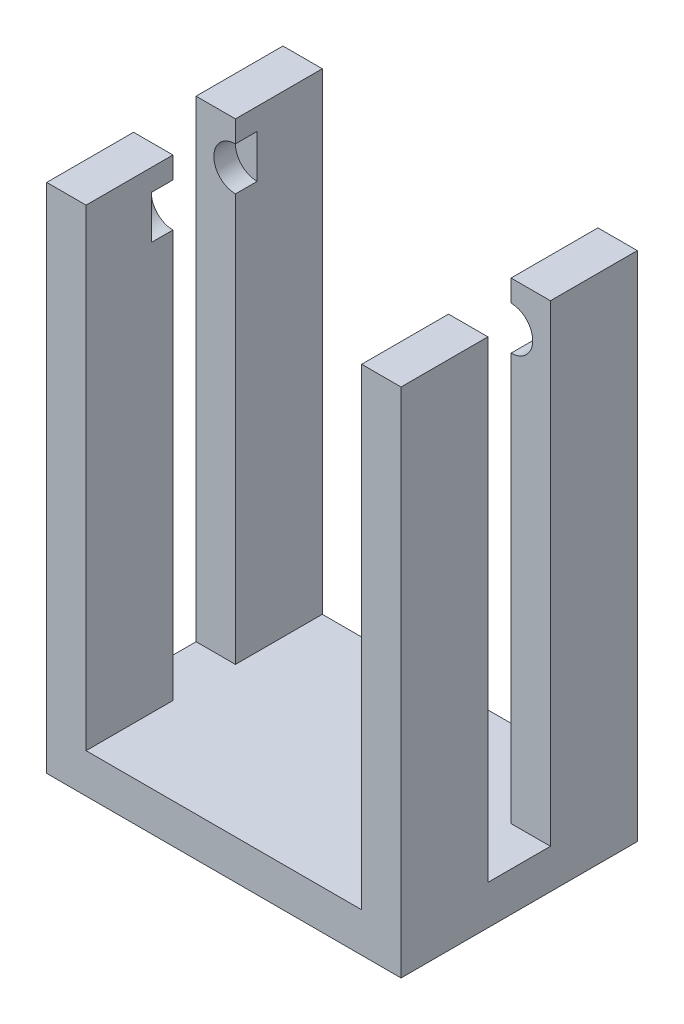
ISO-10303-21;
HEADER;
FILE_DESCRIPTION(('STEP AP214'),'2;1');
FILE_NAME('part.step','',(''),(''),'','','');
FILE_SCHEMA(('AUTOMOTIVE_DESIGN { 1 0 10303 214 1 1 1 1 }'));
ENDSEC;
DATA;
#1=APPLICATION_CONTEXT('core data for automotive mechanical design processes');
#2=APPLICATION_PROTOCOL_DEFINITION('international standard','automotive_design',2000,#1);
#3=PRODUCT_CONTEXT('',#1,'mechanical');
#4=PRODUCT('Part','Part','',(#3));
#5=PRODUCT_RELATED_PRODUCT_CATEGORY('part','',(#4));
#6=PRODUCT_DEFINITION_FORMATION('','',#4);
#7=PRODUCT_DEFINITION_CONTEXT('part definition',#1,'design');
#8=PRODUCT_DEFINITION('design','',#6,#7);
#9=PRODUCT_DEFINITION_SHAPE('','',#8);
#10=(LENGTH_UNIT() NAMED_UNIT(*) SI_UNIT(.MILLI.,.METRE.));
#11=(NAMED_UNIT(*) PLANE_ANGLE_UNIT() SI_UNIT($,.RADIAN.));
#12=(NAMED_UNIT(*) SI_UNIT($,.STERADIAN.) SOLID_ANGLE_UNIT());
#13=UNCERTAINTY_MEASURE_WITH_UNIT(LENGTH_MEASURE(1.E-05),#10,'distance_accuracy_value','');
#14=(GEOMETRIC_REPRESENTATION_CONTEXT(3) GLOBAL_UNCERTAINTY_ASSIGNED_CONTEXT((#13)) GLOBAL_UNIT_ASSIGNED_CONTEXT((#10,
#11,#12)) REPRESENTATION_CONTEXT('',''));
#15=CARTESIAN_POINT('',(0.,0.,0.));
#16=DIRECTION('',(0.,0.,1.));
#17=DIRECTION('',(1.,0.,0.));
#18=AXIS2_PLACEMENT_3D('',#15,#16,#17);
#19=CARTESIAN_POINT('',(0.,1.,0.));
#20=DIRECTION('',(0.,1.,0.));
#21=DIRECTION('',(0.,0.,1.));
#22=AXIS2_PLACEMENT_3D('',#19,#20,#21);
#23=PLANE('',#22);
#24=DIRECTION('',(0.,0.,-1.));
#25=VECTOR('',#24,1.);
#26=CARTESIAN_POINT('',(3.5,1.,0.));
#27=LINE('',#26,#25);
#28=CARTESIAN_POINT('',(3.5,1.,-0.793802437785672));
#29=VERTEX_POINT('',#28);
#30=CARTESIAN_POINT('',(3.5,1.,-3.));
#31=VERTEX_POINT('',#30);
#32=EDGE_CURVE('E280',#29,#31,#27,.T.);
#33=ORIENTED_EDGE('',*,*,#32,.T.);
#34=DIRECTION('',(-1.,0.,0.));
#35=VECTOR('',#34,1.);
#36=CARTESIAN_POINT('',(-4.5,1.,-3.));
#37=LINE('',#36,#35);
#38=CARTESIAN_POINT('',(-3.5,1.,-3.));
#39=VERTEX_POINT('',#38);
#40=EDGE_CURVE('E426',#31,#39,#37,.T.);
#41=ORIENTED_EDGE('',*,*,#40,.T.);
#42=DIRECTION('',(0.,0.,-1.));
#43=VECTOR('',#42,1.);
#44=CARTESIAN_POINT('',(-3.5,1.,0.));
#45=LINE('',#44,#43);
#46=CARTESIAN_POINT('',(-3.5,1.,-0.793802437785672));
#47=VERTEX_POINT('',#46);
#48=EDGE_CURVE('E395',#47,#39,#45,.T.);
#49=ORIENTED_EDGE('',*,*,#48,.F.);
#50=DIRECTION('',(1.,0.,0.));
#51=VECTOR('',#50,1.);
#52=CARTESIAN_POINT('',(0.,1.,-0.793802437785672));
#53=LINE('',#52,#51);
#54=CARTESIAN_POINT('',(-4.5,1.,-0.793802437785672));
#55=VERTEX_POINT('',#54);
#56=EDGE_CURVE('E389',#55,#47,#53,.T.);
#57=ORIENTED_EDGE('',*,*,#56,.F.);
#58=DIRECTION('',(0.,0.,1.));
#59=VECTOR('',#58,1.);
#60=CARTESIAN_POINT('',(-4.5,1.,-3.));
#61=LINE('',#60,#59);
#62=CARTESIAN_POINT('',(-4.5,1.,0.793802437785675));
#63=VERTEX_POINT('',#62);
#64=EDGE_CURVE('E430',#55,#63,#61,.T.);
#65=ORIENTED_EDGE('',*,*,#64,.T.);
#66=DIRECTION('',(1.,0.,0.));
#67=VECTOR('',#66,1.);
#68=CARTESIAN_POINT('',(0.,1.,0.793802437785675));
#69=LINE('',#68,#67);
#70=CARTESIAN_POINT('',(-3.5,1.,0.793802437785675));
#71=VERTEX_POINT('',#70);
#72=EDGE_CURVE('E359',#63,#71,#69,.T.);
#73=ORIENTED_EDGE('',*,*,#72,.T.);
#74=DIRECTION('',(0.,0.,1.));
#75=VECTOR('',#74,1.);
#76=CARTESIAN_POINT('',(-3.5,1.,0.));
#77=LINE('',#76,#75);
#78=CARTESIAN_POINT('',(-3.5,1.,3.));
#79=VERTEX_POINT('',#78);
#80=EDGE_CURVE('E353',#71,#79,#77,.T.);
#81=ORIENTED_EDGE('',*,*,#80,.T.);
#82=DIRECTION('',(1.,0.,0.));
#83=VECTOR('',#82,1.);
#84=CARTESIAN_POINT('',(-4.5,1.,3.));
#85=LINE('',#84,#83);
#86=CARTESIAN_POINT('',(3.5,1.,3.));
#87=VERTEX_POINT('',#86);
#88=EDGE_CURVE('E433',#79,#87,#85,.T.);
#89=ORIENTED_EDGE('',*,*,#88,.T.);
#90=DIRECTION('',(0.,0.,1.));
#91=VECTOR('',#90,1.);
#92=CARTESIAN_POINT('',(3.5,1.,0.));
#93=LINE('',#92,#91);
#94=CARTESIAN_POINT('',(3.5,1.,0.793802437785675));
#95=VERTEX_POINT('',#94);
#96=EDGE_CURVE('E324',#95,#87,#93,.T.);
#97=ORIENTED_EDGE('',*,*,#96,.F.);
#98=DIRECTION('',(-1.,0.,0.));
#99=VECTOR('',#98,1.);
#100=CARTESIAN_POINT('',(0.,1.,0.793802437785675));
#101=LINE('',#100,#99);
#102=CARTESIAN_POINT('',(4.5,1.,0.793802437785675));
#103=VERTEX_POINT('',#102);
#104=EDGE_CURVE('E318',#103,#95,#101,.T.);
#105=ORIENTED_EDGE('',*,*,#104,.F.);
#106=DIRECTION('',(0.,0.,-1.));
#107=VECTOR('',#106,1.);
#108=CARTESIAN_POINT('',(4.5,1.,-3.));
#109=LINE('',#108,#107);
#110=CARTESIAN_POINT('',(4.5,1.,-0.793802437785672));
#111=VERTEX_POINT('',#110);
#112=EDGE_CURVE('E423',#103,#111,#109,.T.);
#113=ORIENTED_EDGE('',*,*,#112,.T.);
#114=DIRECTION('',(-1.,0.,0.));
#115=VECTOR('',#114,1.);
#116=CARTESIAN_POINT('',(0.,1.,-0.793802437785671));
#117=LINE('',#116,#115);
#118=EDGE_CURVE('E288',#111,#29,#117,.T.);
#119=ORIENTED_EDGE('',*,*,#118,.T.);
#120=EDGE_LOOP('',(#33,#41,#49,#57,#65,#73,#81,#89,#97,#105,#113,#119));
#121=FACE_BOUND('',#120,.T.);
#122=ADVANCED_FACE('F47',(#121),#23,.T.);
#123=CARTESIAN_POINT('',(4.5,1.,-3.));
#124=DIRECTION('',(-1.,0.,0.));
#125=DIRECTION('',(0.,0.,1.));
#126=AXIS2_PLACEMENT_3D('',#123,#124,#125);
#127=PLANE('',#126);
#128=DIRECTION('',(0.,0.,-1.));
#129=VECTOR('',#128,1.);
#130=CARTESIAN_POINT('',(4.5,0.,-3.));
#131=LINE('',#130,#129);
#132=CARTESIAN_POINT('',(4.5,0.,3.));
#133=VERTEX_POINT('',#132);
#134=CARTESIAN_POINT('',(4.5,0.,-3.));
#135=VERTEX_POINT('',#134);
#136=EDGE_CURVE('E422',#133,#135,#131,.T.);
#137=ORIENTED_EDGE('',*,*,#136,.T.);
#138=DIRECTION('',(0.,-1.,0.));
#139=VECTOR('',#138,1.);
#140=CARTESIAN_POINT('',(4.5,1.,-3.));
#141=LINE('',#140,#139);
#142=CARTESIAN_POINT('',(4.5,13.,-3.));
#143=VERTEX_POINT('',#142);
#144=EDGE_CURVE('E11',#143,#135,#141,.T.);
#145=ORIENTED_EDGE('',*,*,#144,.F.);
#146=DIRECTION('',(0.,0.,-1.));
#147=VECTOR('',#146,1.);
#148=CARTESIAN_POINT('',(4.5,13.,0.));
#149=LINE('',#148,#147);
#150=CARTESIAN_POINT('',(4.5,13.,-0.793802437785672));
#151=VERTEX_POINT('',#150);
#152=EDGE_CURVE('E292',#151,#143,#149,.T.);
#153=ORIENTED_EDGE('',*,*,#152,.F.);
#154=DIRECTION('',(0.,-1.,0.));
#155=VECTOR('',#154,1.);
#156=CARTESIAN_POINT('',(4.5,13.,-0.793802437785672));
#157=LINE('',#156,#155);
#158=EDGE_CURVE('E309',#151,#111,#157,.T.);
#159=ORIENTED_EDGE('',*,*,#158,.T.);
#160=ORIENTED_EDGE('',*,*,#112,.F.);
#161=DIRECTION('',(0.,-1.,0.));
#162=VECTOR('',#161,1.);
#163=CARTESIAN_POINT('',(4.5,13.,0.793802437785675));
#164=LINE('',#163,#162);
#165=CARTESIAN_POINT('',(4.5,13.,0.793802437785675));
#166=VERTEX_POINT('',#165);
#167=EDGE_CURVE('E334',#166,#103,#164,.T.);
#168=ORIENTED_EDGE('',*,*,#167,.F.);
#169=DIRECTION('',(0.,0.,-1.));
#170=VECTOR('',#169,1.);
#171=CARTESIAN_POINT('',(4.5,13.,0.));
#172=LINE('',#171,#170);
#173=CARTESIAN_POINT('',(4.5,13.,3.));
#174=VERTEX_POINT('',#173);
#175=EDGE_CURVE('E331',#174,#166,#172,.T.);
#176=ORIENTED_EDGE('',*,*,#175,.F.);
#177=DIRECTION('',(0.,-1.,0.));
#178=VECTOR('',#177,1.);
#179=CARTESIAN_POINT('',(4.5,1.,3.));
#180=LINE('',#179,#178);
#181=EDGE_CURVE('E436',#174,#133,#180,.T.);
#182=ORIENTED_EDGE('',*,*,#181,.T.);
#183=EDGE_LOOP('',(#137,#145,#153,#159,#160,#168,#176,#182));
#184=FACE_BOUND('',#183,.T.);
#185=ADVANCED_FACE('F49',(#184),#127,.F.);
#186=CARTESIAN_POINT('',(-4.5,1.,-3.));
#187=DIRECTION('',(0.,0.,1.));
#188=DIRECTION('',(1.,0.,0.));
#189=AXIS2_PLACEMENT_3D('',#186,#187,#188);
#190=PLANE('',#189);
#191=DIRECTION('',(-1.,0.,0.));
#192=VECTOR('',#191,1.);
#193=CARTESIAN_POINT('',(-4.5,0.,-3.));
#194=LINE('',#193,#192);
#195=CARTESIAN_POINT('',(-4.5,0.,-3.));
#196=VERTEX_POINT('',#195);
#197=EDGE_CURVE('E440',#135,#196,#194,.T.);
#198=ORIENTED_EDGE('',*,*,#197,.T.);
#199=DIRECTION('',(0.,-1.,0.));
#200=VECTOR('',#199,1.);
#201=CARTESIAN_POINT('',(-4.5,1.,-3.));
#202=LINE('',#201,#200);
#203=CARTESIAN_POINT('',(-4.5,13.,-3.));
#204=VERTEX_POINT('',#203);
#205=EDGE_CURVE('E56',#204,#196,#202,.T.);
#206=ORIENTED_EDGE('',*,*,#205,.F.);
#207=DIRECTION('',(-1.,0.,0.));
#208=VECTOR('',#207,1.);
#209=CARTESIAN_POINT('',(0.,13.,-3.));
#210=LINE('',#209,#208);
#211=CARTESIAN_POINT('',(-3.5,13.,-3.));
#212=VERTEX_POINT('',#211);
#213=EDGE_CURVE('E398',#212,#204,#210,.T.);
#214=ORIENTED_EDGE('',*,*,#213,.F.);
#215=DIRECTION('',(0.,-1.,0.));
#216=VECTOR('',#215,1.);
#217=CARTESIAN_POINT('',(-3.5,13.,-3.));
#218=LINE('',#217,#216);
#219=EDGE_CURVE('E415',#212,#39,#218,.T.);
#220=ORIENTED_EDGE('',*,*,#219,.T.);
#221=ORIENTED_EDGE('',*,*,#40,.F.);
#222=DIRECTION('',(0.,-1.,0.));
#223=VECTOR('',#222,1.);
#224=CARTESIAN_POINT('',(3.5,13.,-3.));
#225=LINE('',#224,#223);
#226=CARTESIAN_POINT('',(3.5,13.,-3.));
#227=VERTEX_POINT('',#226);
#228=EDGE_CURVE('E299',#227,#31,#225,.T.);
#229=ORIENTED_EDGE('',*,*,#228,.F.);
#230=DIRECTION('',(-1.,0.,0.));
#231=VECTOR('',#230,1.);
#232=CARTESIAN_POINT('',(0.,13.,-3.));
#233=LINE('',#232,#231);
#234=EDGE_CURVE('E296',#143,#227,#233,.T.);
#235=ORIENTED_EDGE('',*,*,#234,.F.);
#236=ORIENTED_EDGE('',*,*,#144,.T.);
#237=EDGE_LOOP('',(#198,#206,#214,#220,#221,#229,#235,#236));
#238=FACE_BOUND('',#237,.T.);
#239=ADVANCED_FACE('F513',(#238),#190,.F.);
#240=CARTESIAN_POINT('',(-4.5,1.,-3.));
#241=DIRECTION('',(1.,0.,0.));
#242=DIRECTION('',(0.,0.,-1.));
#243=AXIS2_PLACEMENT_3D('',#240,#241,#242);
#244=PLANE('',#243);
#245=DIRECTION('',(0.,0.,1.));
#246=VECTOR('',#245,1.);
#247=CARTESIAN_POINT('',(-4.5,0.,-3.));
#248=LINE('',#247,#246);
#249=CARTESIAN_POINT('',(-4.5,0.,3.));
#250=VERTEX_POINT('',#249);
#251=EDGE_CURVE('E443',#196,#250,#248,.T.);
#252=ORIENTED_EDGE('',*,*,#251,.T.);
#253=DIRECTION('',(0.,-1.,0.));
#254=VECTOR('',#253,1.);
#255=CARTESIAN_POINT('',(-4.5,1.,3.));
#256=LINE('',#255,#254);
#257=CARTESIAN_POINT('',(-4.5,13.,3.));
#258=VERTEX_POINT('',#257);
#259=EDGE_CURVE('E451',#258,#250,#256,.T.);
#260=ORIENTED_EDGE('',*,*,#259,.F.);
#261=DIRECTION('',(0.,0.,1.));
#262=VECTOR('',#261,1.);
#263=CARTESIAN_POINT('',(-4.5,13.,0.));
#264=LINE('',#263,#262);
#265=CARTESIAN_POINT('',(-4.5,13.,0.793802437785675));
#266=VERTEX_POINT('',#265);
#267=EDGE_CURVE('E363',#266,#258,#264,.T.);
#268=ORIENTED_EDGE('',*,*,#267,.F.);
#269=DIRECTION('',(0.,-1.,0.));
#270=VECTOR('',#269,1.);
#271=CARTESIAN_POINT('',(-4.5,13.,0.793802437785675));
#272=LINE('',#271,#270);
#273=EDGE_CURVE('E380',#266,#63,#272,.T.);
#274=ORIENTED_EDGE('',*,*,#273,.T.);
#275=ORIENTED_EDGE('',*,*,#64,.F.);
#276=DIRECTION('',(0.,-1.,0.));
#277=VECTOR('',#276,1.);
#278=CARTESIAN_POINT('',(-4.5,13.,-0.793802437785672));
#279=LINE('',#278,#277);
#280=CARTESIAN_POINT('',(-4.5,13.,-0.793802437785672));
#281=VERTEX_POINT('',#280);
#282=EDGE_CURVE('E405',#281,#55,#279,.T.);
#283=ORIENTED_EDGE('',*,*,#282,.F.);
#284=DIRECTION('',(0.,0.,1.));
#285=VECTOR('',#284,1.);
#286=CARTESIAN_POINT('',(-4.5,13.,0.));
#287=LINE('',#286,#285);
#288=EDGE_CURVE('E402',#204,#281,#287,.T.);
#289=ORIENTED_EDGE('',*,*,#288,.F.);
#290=ORIENTED_EDGE('',*,*,#205,.T.);
#291=EDGE_LOOP('',(#252,#260,#268,#274,#275,#283,#289,#290));
#292=FACE_BOUND('',#291,.T.);
#293=ADVANCED_FACE('F459',(#292),#244,.F.);
#294=CARTESIAN_POINT('',(-4.5,1.,3.));
#295=DIRECTION('',(0.,0.,-1.));
#296=DIRECTION('',(-1.,0.,0.));
#297=AXIS2_PLACEMENT_3D('',#294,#295,#296);
#298=PLANE('',#297);
#299=DIRECTION('',(1.,0.,0.));
#300=VECTOR('',#299,1.);
#301=CARTESIAN_POINT('',(-4.5,0.,3.));
#302=LINE('',#301,#300);
#303=EDGE_CURVE('E427',#250,#133,#302,.T.);
#304=ORIENTED_EDGE('',*,*,#303,.T.);
#305=ORIENTED_EDGE('',*,*,#181,.F.);
#306=DIRECTION('',(1.,0.,0.));
#307=VECTOR('',#306,1.);
#308=CARTESIAN_POINT('',(0.,13.,3.));
#309=LINE('',#308,#307);
#310=CARTESIAN_POINT('',(3.5,13.,3.));
#311=VERTEX_POINT('',#310);
#312=EDGE_CURVE('E327',#311,#174,#309,.T.);
#313=ORIENTED_EDGE('',*,*,#312,.F.);
#314=DIRECTION('',(0.,-1.,0.));
#315=VECTOR('',#314,1.);
#316=CARTESIAN_POINT('',(3.5,13.,3.));
#317=LINE('',#316,#315);
#318=EDGE_CURVE('E344',#311,#87,#317,.T.);
#319=ORIENTED_EDGE('',*,*,#318,.T.);
#320=ORIENTED_EDGE('',*,*,#88,.F.);
#321=DIRECTION('',(0.,-1.,0.));
#322=VECTOR('',#321,1.);
#323=CARTESIAN_POINT('',(-3.5,13.,3.));
#324=LINE('',#323,#322);
#325=CARTESIAN_POINT('',(-3.5,13.,3.));
#326=VERTEX_POINT('',#325);
#327=EDGE_CURVE('E370',#326,#79,#324,.T.);
#328=ORIENTED_EDGE('',*,*,#327,.F.);
#329=DIRECTION('',(1.,0.,0.));
#330=VECTOR('',#329,1.);
#331=CARTESIAN_POINT('',(0.,13.,3.));
#332=LINE('',#331,#330);
#333=EDGE_CURVE('E367',#258,#326,#332,.T.);
#334=ORIENTED_EDGE('',*,*,#333,.F.);
#335=ORIENTED_EDGE('',*,*,#259,.T.);
#336=EDGE_LOOP('',(#304,#305,#313,#319,#320,#328,#334,#335));
#337=FACE_BOUND('',#336,.T.);
#338=ADVANCED_FACE('F468',(#337),#298,.F.);
#339=CARTESIAN_POINT('',(0.,0.,0.));
#340=DIRECTION('',(0.,1.,0.));
#341=DIRECTION('',(0.,0.,1.));
#342=AXIS2_PLACEMENT_3D('',#339,#340,#341);
#343=PLANE('',#342);
#344=ORIENTED_EDGE('',*,*,#136,.F.);
#345=ORIENTED_EDGE('',*,*,#303,.F.);
#346=ORIENTED_EDGE('',*,*,#251,.F.);
#347=ORIENTED_EDGE('',*,*,#197,.F.);
#348=EDGE_LOOP('',(#344,#345,#346,#347));
#349=FACE_BOUND('',#348,.T.);
#350=ADVANCED_FACE('F466',(#349),#343,.F.);
#351=CARTESIAN_POINT('',(0.,13.,-0.793802437785672));
#352=DIRECTION('',(0.,0.,-1.));
#353=DIRECTION('',(-1.,0.,0.));
#354=AXIS2_PLACEMENT_3D('',#351,#352,#353);
#355=PLANE('',#354);
#356=DIRECTION('',(0.,-1.,0.));
#357=VECTOR('',#356,1.);
#358=CARTESIAN_POINT('',(-3.5,13.,-0.793802437785672));
#359=LINE('',#358,#357);
#360=CARTESIAN_POINT('',(-3.5,11.35,-0.793802437785672));
#361=VERTEX_POINT('',#360);
#362=EDGE_CURVE('E419',#361,#47,#359,.T.);
#363=ORIENTED_EDGE('',*,*,#362,.F.);
#364=CARTESIAN_POINT('',(-3.5,11.9,-0.793802437785672));
#365=DIRECTION('',(0.,0.,1.));
#366=DIRECTION('',(1.,0.,0.));
#367=AXIS2_PLACEMENT_3D('',#364,#365,#366);
#368=CIRCLE('',#367,0.55);
#369=CARTESIAN_POINT('',(-3.5,12.45,-0.793802437785672));
#370=VERTEX_POINT('',#369);
#371=EDGE_CURVE('E214',#370,#361,#368,.T.);
#372=ORIENTED_EDGE('',*,*,#371,.F.);
#373=CARTESIAN_POINT('',(-3.5,13.,-0.793802437785672));
#374=VERTEX_POINT('',#373);
#375=EDGE_CURVE('E226',#374,#370,#359,.T.);
#376=ORIENTED_EDGE('',*,*,#375,.F.);
#377=DIRECTION('',(1.,0.,0.));
#378=VECTOR('',#377,1.);
#379=CARTESIAN_POINT('',(0.,13.,-0.793802437785672));
#380=LINE('',#379,#378);
#381=EDGE_CURVE('E390',#281,#374,#380,.T.);
#382=ORIENTED_EDGE('',*,*,#381,.F.);
#383=ORIENTED_EDGE('',*,*,#282,.T.);
#384=ORIENTED_EDGE('',*,*,#56,.T.);
#385=EDGE_LOOP('',(#363,#372,#376,#382,#383,#384));
#386=FACE_BOUND('',#385,.T.);
#387=ADVANCED_FACE('F516',(#386),#355,.F.);
#388=CARTESIAN_POINT('',(-3.5,13.,0.));
#389=DIRECTION('',(-1.,0.,0.));
#390=DIRECTION('',(0.,0.,1.));
#391=AXIS2_PLACEMENT_3D('',#388,#389,#390);
#392=PLANE('',#391);
#393=DIRECTION('',(0.,1.,0.));
#394=VECTOR('',#393,1.);
#395=CARTESIAN_POINT('',(-3.5,0.,-1.34380243778567));
#396=LINE('',#395,#394);
#397=CARTESIAN_POINT('',(-3.5,11.35,-1.34380243778567));
#398=VERTEX_POINT('',#397);
#399=CARTESIAN_POINT('',(-3.5,12.45,-1.34380243778567));
#400=VERTEX_POINT('',#399);
#401=EDGE_CURVE('E208',#398,#400,#396,.T.);
#402=ORIENTED_EDGE('',*,*,#401,.F.);
#403=DIRECTION('',(0.,0.,1.));
#404=VECTOR('',#403,1.);
#405=CARTESIAN_POINT('',(-3.5,11.35,-1.34380243778567));
#406=LINE('',#405,#404);
#407=EDGE_CURVE('E220',#398,#361,#406,.T.);
#408=ORIENTED_EDGE('',*,*,#407,.T.);
#409=ORIENTED_EDGE('',*,*,#362,.T.);
#410=ORIENTED_EDGE('',*,*,#48,.T.);
#411=ORIENTED_EDGE('',*,*,#219,.F.);
#412=DIRECTION('',(0.,0.,-1.));
#413=VECTOR('',#412,1.);
#414=CARTESIAN_POINT('',(-3.5,13.,0.));
#415=LINE('',#414,#413);
#416=EDGE_CURVE('E394',#374,#212,#415,.T.);
#417=ORIENTED_EDGE('',*,*,#416,.F.);
#418=ORIENTED_EDGE('',*,*,#375,.T.);
#419=DIRECTION('',(0.,0.,1.));
#420=VECTOR('',#419,1.);
#421=CARTESIAN_POINT('',(-3.5,12.45,-1.34380243778567));
#422=LINE('',#421,#420);
#423=EDGE_CURVE('E218',#400,#370,#422,.T.);
#424=ORIENTED_EDGE('',*,*,#423,.F.);
#425=EDGE_LOOP('',(#402,#408,#409,#410,#411,#417,#418,#424));
#426=FACE_BOUND('',#425,.T.);
#427=ADVANCED_FACE('F224',(#426),#392,.F.);
#428=CARTESIAN_POINT('',(0.,13.,0.));
#429=DIRECTION('',(0.,1.,0.));
#430=DIRECTION('',(0.,0.,1.));
#431=AXIS2_PLACEMENT_3D('',#428,#429,#430);
#432=PLANE('',#431);
#433=ORIENTED_EDGE('',*,*,#381,.T.);
#434=ORIENTED_EDGE('',*,*,#416,.T.);
#435=ORIENTED_EDGE('',*,*,#213,.T.);
#436=ORIENTED_EDGE('',*,*,#288,.T.);
#437=EDGE_LOOP('',(#433,#434,#435,#436));
#438=FACE_BOUND('',#437,.T.);
#439=ADVANCED_FACE('F585',(#438),#432,.T.);
#440=CARTESIAN_POINT('',(-3.5,13.,0.));
#441=DIRECTION('',(1.,0.,0.));
#442=DIRECTION('',(0.,0.,-1.));
#443=AXIS2_PLACEMENT_3D('',#440,#441,#442);
#444=PLANE('',#443);
#445=DIRECTION('',(0.,0.,-1.));
#446=VECTOR('',#445,1.);
#447=CARTESIAN_POINT('',(-3.5,11.35,1.34380243778568));
#448=LINE('',#447,#446);
#449=CARTESIAN_POINT('',(-3.5,11.35,1.34380243778568));
#450=VERTEX_POINT('',#449);
#451=CARTESIAN_POINT('',(-3.5,11.35,0.793802437785675));
#452=VERTEX_POINT('',#451);
#453=EDGE_CURVE('E70',#450,#452,#448,.T.);
#454=ORIENTED_EDGE('',*,*,#453,.F.);
#455=DIRECTION('',(0.,-1.,0.));
#456=VECTOR('',#455,1.);
#457=CARTESIAN_POINT('',(-3.5,0.,1.34380243778568));
#458=LINE('',#457,#456);
#459=CARTESIAN_POINT('',(-3.5,12.45,1.34380243778568));
#460=VERTEX_POINT('',#459);
#461=EDGE_CURVE('E234',#460,#450,#458,.T.);
#462=ORIENTED_EDGE('',*,*,#461,.F.);
#463=DIRECTION('',(0.,0.,-1.));
#464=VECTOR('',#463,1.);
#465=CARTESIAN_POINT('',(-3.5,12.45,1.34380243778568));
#466=LINE('',#465,#464);
#467=CARTESIAN_POINT('',(-3.5,12.45,0.793802437785675));
#468=VERTEX_POINT('',#467);
#469=EDGE_CURVE('E243',#460,#468,#466,.T.);
#470=ORIENTED_EDGE('',*,*,#469,.T.);
#471=DIRECTION('',(0.,-1.,0.));
#472=VECTOR('',#471,1.);
#473=CARTESIAN_POINT('',(-3.5,13.,0.793802437785675));
#474=LINE('',#473,#472);
#475=CARTESIAN_POINT('',(-3.5,13.,0.793802437785675));
#476=VERTEX_POINT('',#475);
#477=EDGE_CURVE('E385',#476,#468,#474,.T.);
#478=ORIENTED_EDGE('',*,*,#477,.F.);
#479=DIRECTION('',(0.,0.,1.));
#480=VECTOR('',#479,1.);
#481=CARTESIAN_POINT('',(-3.5,13.,0.));
#482=LINE('',#481,#480);
#483=EDGE_CURVE('E354',#476,#326,#482,.T.);
#484=ORIENTED_EDGE('',*,*,#483,.T.);
#485=ORIENTED_EDGE('',*,*,#327,.T.);
#486=ORIENTED_EDGE('',*,*,#80,.F.);
#487=EDGE_CURVE('E384',#452,#71,#474,.T.);
#488=ORIENTED_EDGE('',*,*,#487,.F.);
#489=EDGE_LOOP('',(#454,#462,#470,#478,#484,#485,#486,#488));
#490=FACE_BOUND('',#489,.T.);
#491=ADVANCED_FACE('F581',(#490),#444,.T.);
#492=CARTESIAN_POINT('',(0.,13.,0.793802437785675));
#493=DIRECTION('',(0.,0.,-1.));
#494=DIRECTION('',(-1.,0.,0.));
#495=AXIS2_PLACEMENT_3D('',#492,#493,#494);
#496=PLANE('',#495);
#497=CARTESIAN_POINT('',(-3.5,11.9,0.793802437785675));
#498=DIRECTION('',(0.,0.,-1.));
#499=DIRECTION('',(-1.,0.,0.));
#500=AXIS2_PLACEMENT_3D('',#497,#498,#499);
#501=CIRCLE('',#500,0.55);
#502=EDGE_CURVE('E230',#452,#468,#501,.T.);
#503=ORIENTED_EDGE('',*,*,#502,.F.);
#504=ORIENTED_EDGE('',*,*,#487,.T.);
#505=ORIENTED_EDGE('',*,*,#72,.F.);
#506=ORIENTED_EDGE('',*,*,#273,.F.);
#507=DIRECTION('',(1.,0.,0.));
#508=VECTOR('',#507,1.);
#509=CARTESIAN_POINT('',(0.,13.,0.793802437785675));
#510=LINE('',#509,#508);
#511=EDGE_CURVE('E358',#266,#476,#510,.T.);
#512=ORIENTED_EDGE('',*,*,#511,.T.);
#513=ORIENTED_EDGE('',*,*,#477,.T.);
#514=EDGE_LOOP('',(#503,#504,#505,#506,#512,#513));
#515=FACE_BOUND('',#514,.T.);
#516=ADVANCED_FACE('F577',(#515),#496,.T.);
#517=CARTESIAN_POINT('',(0.,13.,0.));
#518=DIRECTION('',(0.,1.,0.));
#519=DIRECTION('',(0.,0.,1.));
#520=AXIS2_PLACEMENT_3D('',#517,#518,#519);
#521=PLANE('',#520);
#522=ORIENTED_EDGE('',*,*,#483,.F.);
#523=ORIENTED_EDGE('',*,*,#511,.F.);
#524=ORIENTED_EDGE('',*,*,#267,.T.);
#525=ORIENTED_EDGE('',*,*,#333,.T.);
#526=EDGE_LOOP('',(#522,#523,#524,#525));
#527=FACE_BOUND('',#526,.T.);
#528=ADVANCED_FACE('F574',(#527),#521,.T.);
#529=CARTESIAN_POINT('',(0.,13.,0.793802437785675));
#530=DIRECTION('',(0.,0.,1.));
#531=DIRECTION('',(1.,0.,0.));
#532=AXIS2_PLACEMENT_3D('',#529,#530,#531);
#533=PLANE('',#532);
#534=DIRECTION('',(0.,-1.,0.));
#535=VECTOR('',#534,1.);
#536=CARTESIAN_POINT('',(3.5,13.,0.793802437785675));
#537=LINE('',#536,#535);
#538=CARTESIAN_POINT('',(3.5,11.35,0.793802437785675));
#539=VERTEX_POINT('',#538);
#540=EDGE_CURVE('E348',#539,#95,#537,.T.);
#541=ORIENTED_EDGE('',*,*,#540,.F.);
#542=CARTESIAN_POINT('',(3.5,11.9,0.793802437785675));
#543=DIRECTION('',(0.,0.,-1.));
#544=DIRECTION('',(-1.,0.,0.));
#545=AXIS2_PLACEMENT_3D('',#542,#543,#544);
#546=CIRCLE('',#545,0.55);
#547=CARTESIAN_POINT('',(3.5,12.45,0.793802437785675));
#548=VERTEX_POINT('',#547);
#549=EDGE_CURVE('E247',#548,#539,#546,.T.);
#550=ORIENTED_EDGE('',*,*,#549,.F.);
#551=CARTESIAN_POINT('',(3.5,13.,0.793802437785675));
#552=VERTEX_POINT('',#551);
#553=EDGE_CURVE('E349',#552,#548,#537,.T.);
#554=ORIENTED_EDGE('',*,*,#553,.F.);
#555=DIRECTION('',(-1.,0.,0.));
#556=VECTOR('',#555,1.);
#557=CARTESIAN_POINT('',(0.,13.,0.793802437785675));
#558=LINE('',#557,#556);
#559=EDGE_CURVE('E319',#166,#552,#558,.T.);
#560=ORIENTED_EDGE('',*,*,#559,.F.);
#561=ORIENTED_EDGE('',*,*,#167,.T.);
#562=ORIENTED_EDGE('',*,*,#104,.T.);
#563=EDGE_LOOP('',(#541,#550,#554,#560,#561,#562));
#564=FACE_BOUND('',#563,.T.);
#565=ADVANCED_FACE('F488',(#564),#533,.F.);
#566=CARTESIAN_POINT('',(3.5,13.,0.));
#567=DIRECTION('',(1.,0.,0.));
#568=DIRECTION('',(0.,0.,-1.));
#569=AXIS2_PLACEMENT_3D('',#566,#567,#568);
#570=PLANE('',#569);
#571=DIRECTION('',(0.,1.,0.));
#572=VECTOR('',#571,1.);
#573=CARTESIAN_POINT('',(3.5,0.,1.34380243778568));
#574=LINE('',#573,#572);
#575=CARTESIAN_POINT('',(3.5,11.35,1.34380243778568));
#576=VERTEX_POINT('',#575);
#577=CARTESIAN_POINT('',(3.5,12.45,1.34380243778568));
#578=VERTEX_POINT('',#577);
#579=EDGE_CURVE('E250',#576,#578,#574,.T.);
#580=ORIENTED_EDGE('',*,*,#579,.F.);
#581=DIRECTION('',(0.,0.,-1.));
#582=VECTOR('',#581,1.);
#583=CARTESIAN_POINT('',(3.5,11.35,1.34380243778568));
#584=LINE('',#583,#582);
#585=EDGE_CURVE('E259',#576,#539,#584,.T.);
#586=ORIENTED_EDGE('',*,*,#585,.T.);
#587=ORIENTED_EDGE('',*,*,#540,.T.);
#588=ORIENTED_EDGE('',*,*,#96,.T.);
#589=ORIENTED_EDGE('',*,*,#318,.F.);
#590=DIRECTION('',(0.,0.,1.));
#591=VECTOR('',#590,1.);
#592=CARTESIAN_POINT('',(3.5,13.,0.));
#593=LINE('',#592,#591);
#594=EDGE_CURVE('E323',#552,#311,#593,.T.);
#595=ORIENTED_EDGE('',*,*,#594,.F.);
#596=ORIENTED_EDGE('',*,*,#553,.T.);
#597=DIRECTION('',(0.,0.,-1.));
#598=VECTOR('',#597,1.);
#599=CARTESIAN_POINT('',(3.5,12.45,1.34380243778568));
#600=LINE('',#599,#598);
#601=EDGE_CURVE('E256',#578,#548,#600,.T.);
#602=ORIENTED_EDGE('',*,*,#601,.F.);
#603=EDGE_LOOP('',(#580,#586,#587,#588,#589,#595,#596,#602));
#604=FACE_BOUND('',#603,.T.);
#605=ADVANCED_FACE('F482',(#604),#570,.F.);
#606=CARTESIAN_POINT('',(0.,13.,0.));
#607=DIRECTION('',(0.,1.,0.));
#608=DIRECTION('',(0.,0.,1.));
#609=AXIS2_PLACEMENT_3D('',#606,#607,#608);
#610=PLANE('',#609);
#611=ORIENTED_EDGE('',*,*,#559,.T.);
#612=ORIENTED_EDGE('',*,*,#594,.T.);
#613=ORIENTED_EDGE('',*,*,#312,.T.);
#614=ORIENTED_EDGE('',*,*,#175,.T.);
#615=EDGE_LOOP('',(#611,#612,#613,#614));
#616=FACE_BOUND('',#615,.T.);
#617=ADVANCED_FACE('F476',(#616),#610,.T.);
#618=CARTESIAN_POINT('',(3.5,13.,0.));
#619=DIRECTION('',(-1.,0.,0.));
#620=DIRECTION('',(0.,0.,1.));
#621=AXIS2_PLACEMENT_3D('',#618,#619,#620);
#622=PLANE('',#621);
#623=DIRECTION('',(0.,0.,1.));
#624=VECTOR('',#623,1.);
#625=CARTESIAN_POINT('',(3.5,11.3475197973409,-1.34380243778567));
#626=LINE('',#625,#624);
#627=CARTESIAN_POINT('',(3.5,11.3475197973409,-1.34380243778567));
#628=VERTEX_POINT('',#627);
#629=CARTESIAN_POINT('',(3.5,11.3475197973409,-0.793802437785672));
#630=VERTEX_POINT('',#629);
#631=EDGE_CURVE('E273',#628,#630,#626,.T.);
#632=ORIENTED_EDGE('',*,*,#631,.F.);
#633=DIRECTION('',(0.,-1.,0.));
#634=VECTOR('',#633,1.);
#635=CARTESIAN_POINT('',(3.5,0.,-1.34380243778567));
#636=LINE('',#635,#634);
#637=CARTESIAN_POINT('',(3.5,12.4475197973409,-1.34380243778567));
#638=VERTEX_POINT('',#637);
#639=EDGE_CURVE('E266',#638,#628,#636,.T.);
#640=ORIENTED_EDGE('',*,*,#639,.F.);
#641=DIRECTION('',(0.,0.,1.));
#642=VECTOR('',#641,1.);
#643=CARTESIAN_POINT('',(3.5,12.4475197973409,-1.34380243778567));
#644=LINE('',#643,#642);
#645=CARTESIAN_POINT('',(3.5,12.4475197973409,-0.793802437785671));
#646=VERTEX_POINT('',#645);
#647=EDGE_CURVE('E276',#638,#646,#644,.T.);
#648=ORIENTED_EDGE('',*,*,#647,.T.);
#649=DIRECTION('',(0.,-1.,0.));
#650=VECTOR('',#649,1.);
#651=CARTESIAN_POINT('',(3.5,13.,-0.793802437785672));
#652=LINE('',#651,#650);
#653=CARTESIAN_POINT('',(3.5,13.,-0.793802437785672));
#654=VERTEX_POINT('',#653);
#655=EDGE_CURVE('E314',#654,#646,#652,.T.);
#656=ORIENTED_EDGE('',*,*,#655,.F.);
#657=DIRECTION('',(0.,0.,-1.));
#658=VECTOR('',#657,1.);
#659=CARTESIAN_POINT('',(3.5,13.,0.));
#660=LINE('',#659,#658);
#661=EDGE_CURVE('E283',#654,#227,#660,.T.);
#662=ORIENTED_EDGE('',*,*,#661,.T.);
#663=ORIENTED_EDGE('',*,*,#228,.T.);
#664=ORIENTED_EDGE('',*,*,#32,.F.);
#665=EDGE_CURVE('E313',#630,#29,#652,.T.);
#666=ORIENTED_EDGE('',*,*,#665,.F.);
#667=EDGE_LOOP('',(#632,#640,#648,#656,#662,#663,#664,#666));
#668=FACE_BOUND('',#667,.T.);
#669=ADVANCED_FACE('F541',(#668),#622,.T.);
#670=CARTESIAN_POINT('',(0.,13.,-0.793802437785671));
#671=DIRECTION('',(0.,0.,1.));
#672=DIRECTION('',(1.,0.,0.));
#673=AXIS2_PLACEMENT_3D('',#670,#671,#672);
#674=PLANE('',#673);
#675=CARTESIAN_POINT('',(3.5,11.8975197973409,-0.793802437785671));
#676=DIRECTION('',(0.,0.,1.));
#677=DIRECTION('',(1.,0.,0.));
#678=AXIS2_PLACEMENT_3D('',#675,#676,#677);
#679=CIRCLE('',#678,0.55);
#680=EDGE_CURVE('E263',#630,#646,#679,.T.);
#681=ORIENTED_EDGE('',*,*,#680,.F.);
#682=ORIENTED_EDGE('',*,*,#665,.T.);
#683=ORIENTED_EDGE('',*,*,#118,.F.);
#684=ORIENTED_EDGE('',*,*,#158,.F.);
#685=DIRECTION('',(-1.,0.,0.));
#686=VECTOR('',#685,1.);
#687=CARTESIAN_POINT('',(0.,13.,-0.793802437785671));
#688=LINE('',#687,#686);
#689=EDGE_CURVE('E287',#151,#654,#688,.T.);
#690=ORIENTED_EDGE('',*,*,#689,.T.);
#691=ORIENTED_EDGE('',*,*,#655,.T.);
#692=EDGE_LOOP('',(#681,#682,#683,#684,#690,#691));
#693=FACE_BOUND('',#692,.T.);
#694=ADVANCED_FACE('F535',(#693),#674,.T.);
#695=CARTESIAN_POINT('',(0.,13.,0.));
#696=DIRECTION('',(0.,1.,0.));
#697=DIRECTION('',(0.,0.,1.));
#698=AXIS2_PLACEMENT_3D('',#695,#696,#697);
#699=PLANE('',#698);
#700=ORIENTED_EDGE('',*,*,#661,.F.);
#701=ORIENTED_EDGE('',*,*,#689,.F.);
#702=ORIENTED_EDGE('',*,*,#152,.T.);
#703=ORIENTED_EDGE('',*,*,#234,.T.);
#704=EDGE_LOOP('',(#700,#701,#702,#703));
#705=FACE_BOUND('',#704,.T.);
#706=ADVANCED_FACE('F532',(#705),#699,.T.);
#707=CARTESIAN_POINT('',(3.5,11.8975197973409,-1.34380243778567));
#708=DIRECTION('',(0.,0.,1.));
#709=DIRECTION('',(1.,0.,0.));
#710=AXIS2_PLACEMENT_3D('',#707,#708,#709);
#711=CYLINDRICAL_SURFACE('',#710,0.55);
#712=ORIENTED_EDGE('',*,*,#680,.T.);
#713=ORIENTED_EDGE('',*,*,#647,.F.);
#714=CARTESIAN_POINT('',(3.5,11.8975197973409,-1.34380243778567));
#715=DIRECTION('',(0.,0.,1.));
#716=DIRECTION('',(1.,0.,0.));
#717=AXIS2_PLACEMENT_3D('',#714,#715,#716);
#718=CIRCLE('',#717,0.55);
#719=EDGE_CURVE('E269',#628,#638,#718,.T.);
#720=ORIENTED_EDGE('',*,*,#719,.F.);
#721=ORIENTED_EDGE('',*,*,#631,.T.);
#722=EDGE_LOOP('',(#712,#713,#720,#721));
#723=FACE_BOUND('',#722,.T.);
#724=ADVANCED_FACE('F551',(#723),#711,.F.);
#725=CARTESIAN_POINT('',(0.,0.,-1.34380243778567));
#726=DIRECTION('',(0.,0.,1.));
#727=DIRECTION('',(1.,0.,0.));
#728=AXIS2_PLACEMENT_3D('',#725,#726,#727);
#729=PLANE('',#728);
#730=ORIENTED_EDGE('',*,*,#639,.T.);
#731=ORIENTED_EDGE('',*,*,#719,.T.);
#732=EDGE_LOOP('',(#730,#731));
#733=FACE_BOUND('',#732,.T.);
#734=ADVANCED_FACE('F506',(#733),#729,.T.);
#735=CARTESIAN_POINT('',(3.5,11.9,1.34380243778568));
#736=DIRECTION('',(0.,0.,-1.));
#737=DIRECTION('',(-1.,0.,0.));
#738=AXIS2_PLACEMENT_3D('',#735,#736,#737);
#739=CYLINDRICAL_SURFACE('',#738,0.55);
#740=ORIENTED_EDGE('',*,*,#549,.T.);
#741=ORIENTED_EDGE('',*,*,#585,.F.);
#742=CARTESIAN_POINT('',(3.5,11.9,1.34380243778568));
#743=DIRECTION('',(0.,0.,-1.));
#744=DIRECTION('',(-1.,0.,0.));
#745=AXIS2_PLACEMENT_3D('',#742,#743,#744);
#746=CIRCLE('',#745,0.55);
#747=EDGE_CURVE('E253',#578,#576,#746,.T.);
#748=ORIENTED_EDGE('',*,*,#747,.F.);
#749=ORIENTED_EDGE('',*,*,#601,.T.);
#750=EDGE_LOOP('',(#740,#741,#748,#749));
#751=FACE_BOUND('',#750,.T.);
#752=ADVANCED_FACE('F493',(#751),#739,.F.);
#753=CARTESIAN_POINT('',(0.,0.,1.34380243778568));
#754=DIRECTION('',(0.,0.,-1.));
#755=DIRECTION('',(-1.,0.,0.));
#756=AXIS2_PLACEMENT_3D('',#753,#754,#755);
#757=PLANE('',#756);
#758=ORIENTED_EDGE('',*,*,#579,.T.);
#759=ORIENTED_EDGE('',*,*,#747,.T.);
#760=EDGE_LOOP('',(#758,#759));
#761=FACE_BOUND('',#760,.T.);
#762=ADVANCED_FACE('F496',(#761),#757,.T.);
#763=CARTESIAN_POINT('',(-3.5,11.9,1.34380243778568));
#764=DIRECTION('',(0.,0.,-1.));
#765=DIRECTION('',(-1.,0.,0.));
#766=AXIS2_PLACEMENT_3D('',#763,#764,#765);
#767=CYLINDRICAL_SURFACE('',#766,0.55);
#768=ORIENTED_EDGE('',*,*,#502,.T.);
#769=ORIENTED_EDGE('',*,*,#469,.F.);
#770=CARTESIAN_POINT('',(-3.5,11.9,1.34380243778568));
#771=DIRECTION('',(0.,0.,-1.));
#772=DIRECTION('',(-1.,0.,0.));
#773=AXIS2_PLACEMENT_3D('',#770,#771,#772);
#774=CIRCLE('',#773,0.55);
#775=EDGE_CURVE('E237',#450,#460,#774,.T.);
#776=ORIENTED_EDGE('',*,*,#775,.F.);
#777=ORIENTED_EDGE('',*,*,#453,.T.);
#778=EDGE_LOOP('',(#768,#769,#776,#777));
#779=FACE_BOUND('',#778,.T.);
#780=ADVANCED_FACE('F498',(#779),#767,.F.);
#781=CARTESIAN_POINT('',(0.,0.,1.34380243778568));
#782=DIRECTION('',(0.,0.,-1.));
#783=DIRECTION('',(-1.,0.,0.));
#784=AXIS2_PLACEMENT_3D('',#781,#782,#783);
#785=PLANE('',#784);
#786=ORIENTED_EDGE('',*,*,#461,.T.);
#787=ORIENTED_EDGE('',*,*,#775,.T.);
#788=EDGE_LOOP('',(#786,#787));
#789=FACE_BOUND('',#788,.T.);
#790=ADVANCED_FACE('F504',(#789),#785,.T.);
#791=CARTESIAN_POINT('',(-3.5,11.9,-1.34380243778567));
#792=DIRECTION('',(0.,0.,1.));
#793=DIRECTION('',(1.,0.,0.));
#794=AXIS2_PLACEMENT_3D('',#791,#792,#793);
#795=CYLINDRICAL_SURFACE('',#794,0.55);
#796=ORIENTED_EDGE('',*,*,#371,.T.);
#797=ORIENTED_EDGE('',*,*,#407,.F.);
#798=CARTESIAN_POINT('',(-3.5,11.9,-1.34380243778567));
#799=DIRECTION('',(0.,0.,1.));
#800=DIRECTION('',(1.,0.,0.));
#801=AXIS2_PLACEMENT_3D('',#798,#799,#800);
#802=CIRCLE('',#801,0.55);
#803=EDGE_CURVE('E62',#400,#398,#802,.T.);
#804=ORIENTED_EDGE('',*,*,#803,.F.);
#805=ORIENTED_EDGE('',*,*,#423,.T.);
#806=EDGE_LOOP('',(#796,#797,#804,#805));
#807=FACE_BOUND('',#806,.T.);
#808=ADVANCED_FACE('F217',(#807),#795,.F.);
#809=CARTESIAN_POINT('',(0.,0.,-1.34380243778567));
#810=DIRECTION('',(0.,0.,1.));
#811=DIRECTION('',(1.,0.,0.));
#812=AXIS2_PLACEMENT_3D('',#809,#810,#811);
#813=PLANE('',#812);
#814=ORIENTED_EDGE('',*,*,#401,.T.);
#815=ORIENTED_EDGE('',*,*,#803,.T.);
#816=EDGE_LOOP('',(#814,#815));
#817=FACE_BOUND('',#816,.T.);
#818=ADVANCED_FACE('F209',(#817),#813,.T.);
#819=CLOSED_SHELL('',(#122,#185,#239,#293,#338,#350,#387,#427,#439,#491,#516,#528,#565,#605,
#617,#669,#694,#706,#724,#734,#752,#762,#780,#790,#808,#818));
#820=MANIFOLD_SOLID_BREP('B2',#819);
#821=ADVANCED_BREP_SHAPE_REPRESENTATION('',(#18,#820),#14);
#822=SHAPE_DEFINITION_REPRESENTATION(#9,#821);
ENDSEC;
END-ISO-10303-21;
